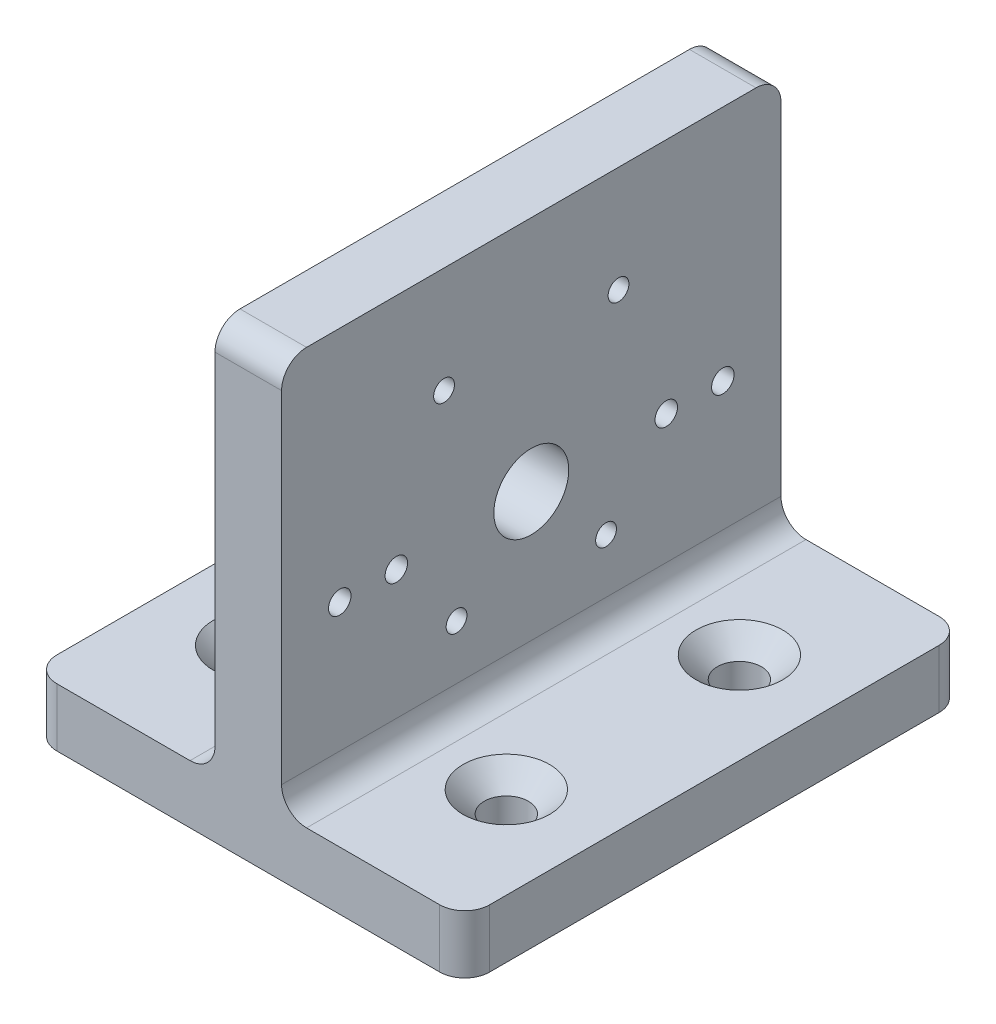
ISO-10303-21;
HEADER;
FILE_DESCRIPTION(('STEP AP214'),'2;1');
FILE_NAME('part.step','',(''),(''),'','','');
FILE_SCHEMA(('AUTOMOTIVE_DESIGN { 1 0 10303 214 1 1 1 1 }'));
ENDSEC;
DATA;
#1=APPLICATION_CONTEXT('core data for automotive mechanical design processes');
#2=APPLICATION_PROTOCOL_DEFINITION('international standard','automotive_design',2000,#1);
#3=PRODUCT_CONTEXT('',#1,'mechanical');
#4=PRODUCT('Part','Part','',(#3));
#5=PRODUCT_RELATED_PRODUCT_CATEGORY('part','',(#4));
#6=PRODUCT_DEFINITION_FORMATION('','',#4);
#7=PRODUCT_DEFINITION_CONTEXT('part definition',#1,'design');
#8=PRODUCT_DEFINITION('design','',#6,#7);
#9=PRODUCT_DEFINITION_SHAPE('','',#8);
#10=(LENGTH_UNIT() NAMED_UNIT(*) SI_UNIT(.MILLI.,.METRE.));
#11=(NAMED_UNIT(*) PLANE_ANGLE_UNIT() SI_UNIT($,.RADIAN.));
#12=(NAMED_UNIT(*) SI_UNIT($,.STERADIAN.) SOLID_ANGLE_UNIT());
#13=UNCERTAINTY_MEASURE_WITH_UNIT(LENGTH_MEASURE(1.E-05),#10,'distance_accuracy_value','');
#14=(GEOMETRIC_REPRESENTATION_CONTEXT(3) GLOBAL_UNCERTAINTY_ASSIGNED_CONTEXT((#13)) GLOBAL_UNIT_ASSIGNED_CONTEXT((#10,
#11,#12)) REPRESENTATION_CONTEXT('',''));
#15=CARTESIAN_POINT('',(0.,0.,0.));
#16=DIRECTION('',(0.,0.,1.));
#17=DIRECTION('',(1.,0.,0.));
#18=AXIS2_PLACEMENT_3D('',#15,#16,#17);
#19=CARTESIAN_POINT('',(-26.,0.,60.));
#20=DIRECTION('',(-1.,0.,0.));
#21=DIRECTION('',(0.,0.,1.));
#22=AXIS2_PLACEMENT_3D('',#19,#20,#21);
#23=PLANE('',#22);
#24=DIRECTION('',(0.,0.,-1.));
#25=VECTOR('',#24,1.);
#26=CARTESIAN_POINT('',(-26.,7.,60.));
#27=LINE('',#26,#25);
#28=CARTESIAN_POINT('',(-26.,7.,57.));
#29=VERTEX_POINT('',#28);
#30=CARTESIAN_POINT('',(-26.,7.,3.));
#31=VERTEX_POINT('',#30);
#32=EDGE_CURVE('E270',#29,#31,#27,.T.);
#33=ORIENTED_EDGE('',*,*,#32,.T.);
#34=DIRECTION('',(0.,1.,0.));
#35=VECTOR('',#34,1.);
#36=CARTESIAN_POINT('',(-26.,0.,3.));
#37=LINE('',#36,#35);
#38=CARTESIAN_POINT('',(-26.,0.,3.));
#39=VERTEX_POINT('',#38);
#40=EDGE_CURVE('E217',#31,#39,#37,.F.);
#41=ORIENTED_EDGE('',*,*,#40,.T.);
#42=DIRECTION('',(0.,0.,-1.));
#43=VECTOR('',#42,1.);
#44=CARTESIAN_POINT('',(-26.,0.,60.));
#45=LINE('',#44,#43);
#46=CARTESIAN_POINT('',(-26.,0.,57.));
#47=VERTEX_POINT('',#46);
#48=EDGE_CURVE('E177',#47,#39,#45,.T.);
#49=ORIENTED_EDGE('',*,*,#48,.F.);
#50=DIRECTION('',(0.,1.,0.));
#51=VECTOR('',#50,1.);
#52=CARTESIAN_POINT('',(-26.,0.,57.));
#53=LINE('',#52,#51);
#54=EDGE_CURVE('E214',#47,#29,#53,.T.);
#55=ORIENTED_EDGE('',*,*,#54,.T.);
#56=EDGE_LOOP('',(#33,#41,#49,#55));
#57=FACE_BOUND('',#56,.T.);
#58=ADVANCED_FACE('F35',(#57),#23,.T.);
#59=CARTESIAN_POINT('',(0.,0.,60.));
#60=DIRECTION('',(0.,1.,0.));
#61=DIRECTION('',(0.,0.,1.));
#62=AXIS2_PLACEMENT_3D('',#59,#60,#61);
#63=PLANE('',#62);
#64=CARTESIAN_POINT('',(-15.,0.,16.));
#65=DIRECTION('',(0.,1.,0.));
#66=DIRECTION('',(0.,0.,1.));
#67=AXIS2_PLACEMENT_3D('',#64,#65,#66);
#68=CIRCLE('',#67,2.65);
#69=CARTESIAN_POINT('',(-15.,0.,18.65));
#70=VERTEX_POINT('',#69);
#71=EDGE_CURVE('E389',#70,#70,#68,.T.);
#72=ORIENTED_EDGE('',*,*,#71,.T.);
#73=EDGE_LOOP('',(#72));
#74=FACE_BOUND('',#73,.T.);
#75=CARTESIAN_POINT('',(-15.,0.,44.));
#76=DIRECTION('',(0.,1.,0.));
#77=DIRECTION('',(0.,0.,1.));
#78=AXIS2_PLACEMENT_3D('',#75,#76,#77);
#79=CIRCLE('',#78,2.65);
#80=CARTESIAN_POINT('',(-15.,0.,46.65));
#81=VERTEX_POINT('',#80);
#82=EDGE_CURVE('E380',#81,#81,#79,.T.);
#83=ORIENTED_EDGE('',*,*,#82,.T.);
#84=EDGE_LOOP('',(#83));
#85=FACE_BOUND('',#84,.T.);
#86=CARTESIAN_POINT('',(15.,0.,44.));
#87=DIRECTION('',(0.,1.,0.));
#88=DIRECTION('',(0.,0.,1.));
#89=AXIS2_PLACEMENT_3D('',#86,#87,#88);
#90=CIRCLE('',#89,2.65);
#91=CARTESIAN_POINT('',(15.,0.,46.65));
#92=VERTEX_POINT('',#91);
#93=EDGE_CURVE('E371',#92,#92,#90,.T.);
#94=ORIENTED_EDGE('',*,*,#93,.T.);
#95=EDGE_LOOP('',(#94));
#96=FACE_BOUND('',#95,.T.);
#97=CARTESIAN_POINT('',(15.,0.,16.));
#98=DIRECTION('',(0.,1.,0.));
#99=DIRECTION('',(0.,0.,1.));
#100=AXIS2_PLACEMENT_3D('',#97,#98,#99);
#101=CIRCLE('',#100,2.65);
#102=CARTESIAN_POINT('',(15.,0.,18.65));
#103=VERTEX_POINT('',#102);
#104=EDGE_CURVE('E362',#103,#103,#101,.T.);
#105=ORIENTED_EDGE('',*,*,#104,.T.);
#106=EDGE_LOOP('',(#105));
#107=FACE_BOUND('',#106,.T.);
#108=DIRECTION('',(1.,0.,0.));
#109=VECTOR('',#108,1.);
#110=CARTESIAN_POINT('',(0.,0.,0.));
#111=LINE('',#110,#109);
#112=CARTESIAN_POINT('',(-23.,0.,0.));
#113=VERTEX_POINT('',#112);
#114=CARTESIAN_POINT('',(23.,0.,0.));
#115=VERTEX_POINT('',#114);
#116=EDGE_CURVE('E279',#113,#115,#111,.T.);
#117=ORIENTED_EDGE('',*,*,#116,.T.);
#118=CARTESIAN_POINT('',(23.,0.,3.));
#119=DIRECTION('',(0.,1.,0.));
#120=DIRECTION('',(0.,0.,1.));
#121=AXIS2_PLACEMENT_3D('',#118,#119,#120);
#122=CIRCLE('',#121,3.);
#123=CARTESIAN_POINT('',(26.,0.,3.));
#124=VERTEX_POINT('',#123);
#125=EDGE_CURVE('E199',#115,#124,#122,.F.);
#126=ORIENTED_EDGE('',*,*,#125,.T.);
#127=DIRECTION('',(0.,0.,-1.));
#128=VECTOR('',#127,1.);
#129=CARTESIAN_POINT('',(26.,0.,60.));
#130=LINE('',#129,#128);
#131=CARTESIAN_POINT('',(26.,0.,57.));
#132=VERTEX_POINT('',#131);
#133=EDGE_CURVE('E171',#132,#124,#130,.T.);
#134=ORIENTED_EDGE('',*,*,#133,.F.);
#135=CARTESIAN_POINT('',(23.,0.,57.));
#136=DIRECTION('',(0.,1.,0.));
#137=DIRECTION('',(0.,0.,1.));
#138=AXIS2_PLACEMENT_3D('',#135,#136,#137);
#139=CIRCLE('',#138,3.);
#140=CARTESIAN_POINT('',(23.,0.,60.));
#141=VERTEX_POINT('',#140);
#142=EDGE_CURVE('E176',#132,#141,#139,.F.);
#143=ORIENTED_EDGE('',*,*,#142,.T.);
#144=DIRECTION('',(1.,0.,0.));
#145=VECTOR('',#144,1.);
#146=CARTESIAN_POINT('',(0.,0.,60.));
#147=LINE('',#146,#145);
#148=CARTESIAN_POINT('',(-23.,0.,60.));
#149=VERTEX_POINT('',#148);
#150=EDGE_CURVE('E287',#149,#141,#147,.T.);
#151=ORIENTED_EDGE('',*,*,#150,.F.);
#152=CARTESIAN_POINT('',(-23.,0.,57.));
#153=DIRECTION('',(0.,1.,0.));
#154=DIRECTION('',(0.,0.,1.));
#155=AXIS2_PLACEMENT_3D('',#152,#153,#154);
#156=CIRCLE('',#155,3.);
#157=EDGE_CURVE('E194',#149,#47,#156,.F.);
#158=ORIENTED_EDGE('',*,*,#157,.T.);
#159=ORIENTED_EDGE('',*,*,#48,.T.);
#160=CARTESIAN_POINT('',(-23.,0.,3.));
#161=DIRECTION('',(0.,1.,0.));
#162=DIRECTION('',(0.,0.,1.));
#163=AXIS2_PLACEMENT_3D('',#160,#161,#162);
#164=CIRCLE('',#163,3.);
#165=EDGE_CURVE('E196',#39,#113,#164,.F.);
#166=ORIENTED_EDGE('',*,*,#165,.T.);
#167=EDGE_LOOP('',(#117,#126,#134,#143,#151,#158,#159,#166));
#168=FACE_BOUND('',#167,.T.);
#169=ADVANCED_FACE('F423',(#74,#85,#96,#107,#168),#63,.F.);
#170=CARTESIAN_POINT('',(26.,0.,60.));
#171=DIRECTION('',(-1.,0.,0.));
#172=DIRECTION('',(0.,0.,1.));
#173=AXIS2_PLACEMENT_3D('',#170,#171,#172);
#174=PLANE('',#173);
#175=ORIENTED_EDGE('',*,*,#133,.T.);
#176=DIRECTION('',(0.,1.,0.));
#177=VECTOR('',#176,1.);
#178=CARTESIAN_POINT('',(26.,0.,3.));
#179=LINE('',#178,#177);
#180=CARTESIAN_POINT('',(26.,7.,3.));
#181=VERTEX_POINT('',#180);
#182=EDGE_CURVE('E170',#124,#181,#179,.T.);
#183=ORIENTED_EDGE('',*,*,#182,.T.);
#184=DIRECTION('',(0.,0.,-1.));
#185=VECTOR('',#184,1.);
#186=CARTESIAN_POINT('',(26.,7.,60.));
#187=LINE('',#186,#185);
#188=CARTESIAN_POINT('',(26.,7.,57.));
#189=VERTEX_POINT('',#188);
#190=EDGE_CURVE('E153',#189,#181,#187,.T.);
#191=ORIENTED_EDGE('',*,*,#190,.F.);
#192=DIRECTION('',(0.,1.,0.));
#193=VECTOR('',#192,1.);
#194=CARTESIAN_POINT('',(26.,0.,57.));
#195=LINE('',#194,#193);
#196=EDGE_CURVE('E167',#189,#132,#195,.F.);
#197=ORIENTED_EDGE('',*,*,#196,.T.);
#198=EDGE_LOOP('',(#175,#183,#191,#197));
#199=FACE_BOUND('',#198,.T.);
#200=ADVANCED_FACE('F166',(#199),#174,.F.);
#201=CARTESIAN_POINT('',(0.,7.,60.));
#202=DIRECTION('',(0.,1.,0.));
#203=DIRECTION('',(-1.,0.,0.));
#204=AXIS2_PLACEMENT_3D('',#201,#202,#203);
#205=PLANE('',#204);
#206=CARTESIAN_POINT('',(15.,7.,44.));
#207=DIRECTION('',(0.,1.,0.));
#208=DIRECTION('',(0.,0.,1.));
#209=AXIS2_PLACEMENT_3D('',#206,#207,#208);
#210=CIRCLE('',#209,5.2);
#211=CARTESIAN_POINT('',(15.,7.,49.2));
#212=VERTEX_POINT('',#211);
#213=EDGE_CURVE('E377',#212,#212,#210,.T.);
#214=ORIENTED_EDGE('',*,*,#213,.F.);
#215=EDGE_LOOP('',(#214));
#216=FACE_BOUND('',#215,.T.);
#217=CARTESIAN_POINT('',(15.,7.,16.));
#218=DIRECTION('',(0.,1.,0.));
#219=DIRECTION('',(0.,0.,1.));
#220=AXIS2_PLACEMENT_3D('',#217,#218,#219);
#221=CIRCLE('',#220,5.2);
#222=CARTESIAN_POINT('',(15.,7.,21.2));
#223=VERTEX_POINT('',#222);
#224=EDGE_CURVE('E368',#223,#223,#221,.T.);
#225=ORIENTED_EDGE('',*,*,#224,.F.);
#226=EDGE_LOOP('',(#225));
#227=FACE_BOUND('',#226,.T.);
#228=ORIENTED_EDGE('',*,*,#190,.T.);
#229=CARTESIAN_POINT('',(23.,7.,3.));
#230=DIRECTION('',(0.,1.,0.));
#231=DIRECTION('',(-1.,0.,0.));
#232=AXIS2_PLACEMENT_3D('',#229,#230,#231);
#233=CIRCLE('',#232,3.);
#234=CARTESIAN_POINT('',(23.,7.,0.));
#235=VERTEX_POINT('',#234);
#236=EDGE_CURVE('E160',#181,#235,#233,.T.);
#237=ORIENTED_EDGE('',*,*,#236,.T.);
#238=DIRECTION('',(1.,0.,0.));
#239=VECTOR('',#238,1.);
#240=CARTESIAN_POINT('',(0.,7.,0.));
#241=LINE('',#240,#239);
#242=CARTESIAN_POINT('',(7.,7.,0.));
#243=VERTEX_POINT('',#242);
#244=EDGE_CURVE('E282',#243,#235,#241,.T.);
#245=ORIENTED_EDGE('',*,*,#244,.F.);
#246=DIRECTION('',(0.,0.,-1.));
#247=VECTOR('',#246,1.);
#248=CARTESIAN_POINT('',(7.,7.,60.));
#249=LINE('',#248,#247);
#250=CARTESIAN_POINT('',(7.,7.,60.));
#251=VERTEX_POINT('',#250);
#252=EDGE_CURVE('E161',#243,#251,#249,.F.);
#253=ORIENTED_EDGE('',*,*,#252,.T.);
#254=DIRECTION('',(1.,0.,0.));
#255=VECTOR('',#254,1.);
#256=CARTESIAN_POINT('',(0.,7.,60.));
#257=LINE('',#256,#255);
#258=CARTESIAN_POINT('',(23.,7.,60.));
#259=VERTEX_POINT('',#258);
#260=EDGE_CURVE('E155',#251,#259,#257,.T.);
#261=ORIENTED_EDGE('',*,*,#260,.T.);
#262=CARTESIAN_POINT('',(23.,7.,57.));
#263=DIRECTION('',(0.,1.,0.));
#264=DIRECTION('',(-1.,0.,0.));
#265=AXIS2_PLACEMENT_3D('',#262,#263,#264);
#266=CIRCLE('',#265,3.);
#267=EDGE_CURVE('E150',#259,#189,#266,.T.);
#268=ORIENTED_EDGE('',*,*,#267,.T.);
#269=EDGE_LOOP('',(#228,#237,#245,#253,#261,#268));
#270=FACE_BOUND('',#269,.T.);
#271=ADVANCED_FACE('F152',(#216,#227,#270),#205,.T.);
#272=CARTESIAN_POINT('',(4.,0.,60.));
#273=DIRECTION('',(1.,0.,0.));
#274=DIRECTION('',(0.,1.,0.));
#275=AXIS2_PLACEMENT_3D('',#272,#273,#274);
#276=PLANE('',#275);
#277=CARTESIAN_POINT('',(4.00000000000001,41.25,40.48));
#278=DIRECTION('',(1.,0.,0.));
#279=DIRECTION('',(0.,0.,-1.));
#280=AXIS2_PLACEMENT_3D('',#277,#278,#279);
#281=CIRCLE('',#280,1.25);
#282=CARTESIAN_POINT('',(4.00000000000001,41.25,39.23));
#283=VERTEX_POINT('',#282);
#284=EDGE_CURVE('E359',#283,#283,#281,.T.);
#285=ORIENTED_EDGE('',*,*,#284,.F.);
#286=EDGE_LOOP('',(#285));
#287=FACE_BOUND('',#286,.T.);
#288=CARTESIAN_POINT('',(4.00000000000001,41.25,19.52));
#289=DIRECTION('',(1.,0.,0.));
#290=DIRECTION('',(0.,0.,-1.));
#291=AXIS2_PLACEMENT_3D('',#288,#289,#290);
#292=CIRCLE('',#291,1.25);
#293=CARTESIAN_POINT('',(4.00000000000001,41.25,18.27));
#294=VERTEX_POINT('',#293);
#295=EDGE_CURVE('E353',#294,#294,#292,.T.);
#296=ORIENTED_EDGE('',*,*,#295,.F.);
#297=EDGE_LOOP('',(#296));
#298=FACE_BOUND('',#297,.T.);
#299=CARTESIAN_POINT('',(4.,16.5197438789309,21.0197438789308));
#300=DIRECTION('',(1.,0.,0.));
#301=DIRECTION('',(0.,0.,-1.));
#302=AXIS2_PLACEMENT_3D('',#299,#300,#301);
#303=CIRCLE('',#302,1.25);
#304=CARTESIAN_POINT('',(4.,16.5197438789309,19.7697438789308));
#305=VERTEX_POINT('',#304);
#306=EDGE_CURVE('E350',#305,#305,#303,.T.);
#307=ORIENTED_EDGE('',*,*,#306,.F.);
#308=EDGE_LOOP('',(#307));
#309=FACE_BOUND('',#308,.T.);
#310=CARTESIAN_POINT('',(4.,16.5197438789309,38.9802561210692));
#311=DIRECTION('',(1.,0.,0.));
#312=DIRECTION('',(0.,0.,-1.));
#313=AXIS2_PLACEMENT_3D('',#310,#311,#312);
#314=CIRCLE('',#313,1.25);
#315=CARTESIAN_POINT('',(4.,16.5197438789309,37.7302561210692));
#316=VERTEX_POINT('',#315);
#317=EDGE_CURVE('E344',#316,#316,#314,.T.);
#318=ORIENTED_EDGE('',*,*,#317,.F.);
#319=EDGE_LOOP('',(#318));
#320=FACE_BOUND('',#319,.T.);
#321=CARTESIAN_POINT('',(4.,25.5,46.215));
#322=DIRECTION('',(1.,0.,0.));
#323=DIRECTION('',(0.,0.,-1.));
#324=AXIS2_PLACEMENT_3D('',#321,#322,#323);
#325=CIRCLE('',#324,1.34999999999999);
#326=CARTESIAN_POINT('',(4.,25.5,44.865));
#327=VERTEX_POINT('',#326);
#328=EDGE_CURVE('E338',#327,#327,#325,.T.);
#329=ORIENTED_EDGE('',*,*,#328,.F.);
#330=EDGE_LOOP('',(#329));
#331=FACE_BOUND('',#330,.T.);
#332=CARTESIAN_POINT('',(4.,25.5,13.785));
#333=DIRECTION('',(1.,0.,0.));
#334=DIRECTION('',(0.,0.,-1.));
#335=AXIS2_PLACEMENT_3D('',#332,#333,#334);
#336=CIRCLE('',#335,1.34999999999999);
#337=CARTESIAN_POINT('',(4.,25.5,12.435));
#338=VERTEX_POINT('',#337);
#339=EDGE_CURVE('E332',#338,#338,#336,.T.);
#340=ORIENTED_EDGE('',*,*,#339,.F.);
#341=EDGE_LOOP('',(#340));
#342=FACE_BOUND('',#341,.T.);
#343=CARTESIAN_POINT('',(4.,25.5,53.0125));
#344=DIRECTION('',(1.,0.,0.));
#345=DIRECTION('',(0.,0.,-1.));
#346=AXIS2_PLACEMENT_3D('',#343,#344,#345);
#347=CIRCLE('',#346,1.34999999999999);
#348=CARTESIAN_POINT('',(4.,25.5,51.6625));
#349=VERTEX_POINT('',#348);
#350=EDGE_CURVE('E326',#349,#349,#347,.T.);
#351=ORIENTED_EDGE('',*,*,#350,.F.);
#352=EDGE_LOOP('',(#351));
#353=FACE_BOUND('',#352,.T.);
#354=CARTESIAN_POINT('',(4.,25.5,6.9875));
#355=DIRECTION('',(1.,0.,0.));
#356=DIRECTION('',(0.,0.,-1.));
#357=AXIS2_PLACEMENT_3D('',#354,#355,#356);
#358=CIRCLE('',#357,1.34999999999999);
#359=CARTESIAN_POINT('',(4.,25.5,5.63750000000001));
#360=VERTEX_POINT('',#359);
#361=EDGE_CURVE('E320',#360,#360,#358,.T.);
#362=ORIENTED_EDGE('',*,*,#361,.F.);
#363=EDGE_LOOP('',(#362));
#364=FACE_BOUND('',#363,.T.);
#365=CARTESIAN_POINT('',(4.,25.5,30.));
#366=DIRECTION('',(1.,0.,0.));
#367=DIRECTION('',(0.,1.,0.));
#368=AXIS2_PLACEMENT_3D('',#365,#366,#367);
#369=CIRCLE('',#368,4.50000000000003);
#370=CARTESIAN_POINT('',(3.99999999999999,30.,30.));
#371=VERTEX_POINT('',#370);
#372=EDGE_CURVE('E314',#371,#371,#369,.T.);
#373=ORIENTED_EDGE('',*,*,#372,.F.);
#374=EDGE_LOOP('',(#373));
#375=FACE_BOUND('',#374,.T.);
#376=DIRECTION('',(0.,-1.,0.));
#377=VECTOR('',#376,1.);
#378=CARTESIAN_POINT('',(4.,0.,60.));
#379=LINE('',#378,#377);
#380=CARTESIAN_POINT('',(4.,51.,60.));
#381=VERTEX_POINT('',#380);
#382=CARTESIAN_POINT('',(4.,10.,60.));
#383=VERTEX_POINT('',#382);
#384=EDGE_CURVE('E275',#381,#383,#379,.T.);
#385=ORIENTED_EDGE('',*,*,#384,.T.);
#386=DIRECTION('',(0.,0.,-1.));
#387=VECTOR('',#386,1.);
#388=CARTESIAN_POINT('',(4.,10.,0.));
#389=LINE('',#388,#387);
#390=CARTESIAN_POINT('',(4.,10.,0.));
#391=VERTEX_POINT('',#390);
#392=EDGE_CURVE('E223',#383,#391,#389,.T.);
#393=ORIENTED_EDGE('',*,*,#392,.T.);
#394=DIRECTION('',(0.,-1.,0.));
#395=VECTOR('',#394,1.);
#396=CARTESIAN_POINT('',(4.,0.,0.));
#397=LINE('',#396,#395);
#398=CARTESIAN_POINT('',(4.,51.,0.));
#399=VERTEX_POINT('',#398);
#400=EDGE_CURVE('E255',#399,#391,#397,.T.);
#401=ORIENTED_EDGE('',*,*,#400,.F.);
#402=CARTESIAN_POINT('',(4.,51.,3.));
#403=DIRECTION('',(1.,0.,0.));
#404=DIRECTION('',(0.,1.,0.));
#405=AXIS2_PLACEMENT_3D('',#402,#403,#404);
#406=CIRCLE('',#405,3.);
#407=CARTESIAN_POINT('',(4.,54.,3.));
#408=VERTEX_POINT('',#407);
#409=EDGE_CURVE('E221',#399,#408,#406,.T.);
#410=ORIENTED_EDGE('',*,*,#409,.T.);
#411=DIRECTION('',(0.,0.,-1.));
#412=VECTOR('',#411,1.);
#413=CARTESIAN_POINT('',(4.,54.,60.));
#414=LINE('',#413,#412);
#415=CARTESIAN_POINT('',(4.,54.,57.));
#416=VERTEX_POINT('',#415);
#417=EDGE_CURVE('E172',#416,#408,#414,.T.);
#418=ORIENTED_EDGE('',*,*,#417,.F.);
#419=CARTESIAN_POINT('',(4.,51.,57.));
#420=DIRECTION('',(1.,0.,0.));
#421=DIRECTION('',(0.,1.,0.));
#422=AXIS2_PLACEMENT_3D('',#419,#420,#421);
#423=CIRCLE('',#422,3.);
#424=EDGE_CURVE('E219',#416,#381,#423,.T.);
#425=ORIENTED_EDGE('',*,*,#424,.T.);
#426=EDGE_LOOP('',(#385,#393,#401,#410,#418,#425));
#427=FACE_BOUND('',#426,.T.);
#428=ADVANCED_FACE('F305',(#287,#298,#309,#320,#331,#342,#353,#364,#375,#427),#276,.T.);
#429=CARTESIAN_POINT('',(0.,54.,60.));
#430=DIRECTION('',(0.,1.,0.));
#431=DIRECTION('',(0.,0.,1.));
#432=AXIS2_PLACEMENT_3D('',#429,#430,#431);
#433=PLANE('',#432);
#434=ORIENTED_EDGE('',*,*,#417,.T.);
#435=DIRECTION('',(1.,0.,0.));
#436=VECTOR('',#435,1.);
#437=CARTESIAN_POINT('',(-4.,54.,3.));
#438=LINE('',#437,#436);
#439=CARTESIAN_POINT('',(-4.,54.,3.));
#440=VERTEX_POINT('',#439);
#441=EDGE_CURVE('E51',#408,#440,#438,.F.);
#442=ORIENTED_EDGE('',*,*,#441,.T.);
#443=DIRECTION('',(0.,0.,-1.));
#444=VECTOR('',#443,1.);
#445=CARTESIAN_POINT('',(-4.,54.,60.));
#446=LINE('',#445,#444);
#447=CARTESIAN_POINT('',(-4.,54.,57.));
#448=VERTEX_POINT('',#447);
#449=EDGE_CURVE('E273',#448,#440,#446,.T.);
#450=ORIENTED_EDGE('',*,*,#449,.F.);
#451=DIRECTION('',(1.,0.,0.));
#452=VECTOR('',#451,1.);
#453=CARTESIAN_POINT('',(0.,54.,57.));
#454=LINE('',#453,#452);
#455=EDGE_CURVE('E231',#448,#416,#454,.T.);
#456=ORIENTED_EDGE('',*,*,#455,.T.);
#457=EDGE_LOOP('',(#434,#442,#450,#456));
#458=FACE_BOUND('',#457,.T.);
#459=ADVANCED_FACE('F456',(#458),#433,.T.);
#460=CARTESIAN_POINT('',(-4.,0.,60.));
#461=DIRECTION('',(1.,0.,0.));
#462=DIRECTION('',(0.,1.,0.));
#463=AXIS2_PLACEMENT_3D('',#460,#461,#462);
#464=PLANE('',#463);
#465=CARTESIAN_POINT('',(-4.,41.25,40.48));
#466=DIRECTION('',(1.,0.,0.));
#467=DIRECTION('',(0.,1.,0.));
#468=AXIS2_PLACEMENT_3D('',#465,#466,#467);
#469=CIRCLE('',#468,1.25);
#470=CARTESIAN_POINT('',(-4.,42.5,40.48));
#471=VERTEX_POINT('',#470);
#472=EDGE_CURVE('E356',#471,#471,#469,.T.);
#473=ORIENTED_EDGE('',*,*,#472,.T.);
#474=EDGE_LOOP('',(#473));
#475=FACE_BOUND('',#474,.T.);
#476=CARTESIAN_POINT('',(-4.,41.25,19.52));
#477=DIRECTION('',(1.,0.,0.));
#478=DIRECTION('',(0.,1.,0.));
#479=AXIS2_PLACEMENT_3D('',#476,#477,#478);
#480=CIRCLE('',#479,1.25);
#481=CARTESIAN_POINT('',(-4.,42.5,19.52));
#482=VERTEX_POINT('',#481);
#483=EDGE_CURVE('E39',#482,#482,#480,.T.);
#484=ORIENTED_EDGE('',*,*,#483,.T.);
#485=EDGE_LOOP('',(#484));
#486=FACE_BOUND('',#485,.T.);
#487=CARTESIAN_POINT('',(-4.,16.5197438789309,21.0197438789308));
#488=DIRECTION('',(1.,0.,0.));
#489=DIRECTION('',(0.,1.,0.));
#490=AXIS2_PLACEMENT_3D('',#487,#488,#489);
#491=CIRCLE('',#490,1.25);
#492=CARTESIAN_POINT('',(-4.,17.7697438789309,21.0197438789308));
#493=VERTEX_POINT('',#492);
#494=EDGE_CURVE('E347',#493,#493,#491,.T.);
#495=ORIENTED_EDGE('',*,*,#494,.T.);
#496=EDGE_LOOP('',(#495));
#497=FACE_BOUND('',#496,.T.);
#498=CARTESIAN_POINT('',(-4.,16.5197438789309,38.9802561210692));
#499=DIRECTION('',(1.,0.,0.));
#500=DIRECTION('',(0.,1.,0.));
#501=AXIS2_PLACEMENT_3D('',#498,#499,#500);
#502=CIRCLE('',#501,1.25);
#503=CARTESIAN_POINT('',(-4.,17.7697438789309,38.9802561210692));
#504=VERTEX_POINT('',#503);
#505=EDGE_CURVE('E341',#504,#504,#502,.T.);
#506=ORIENTED_EDGE('',*,*,#505,.T.);
#507=EDGE_LOOP('',(#506));
#508=FACE_BOUND('',#507,.T.);
#509=CARTESIAN_POINT('',(-4.,25.5,46.215));
#510=DIRECTION('',(1.,0.,0.));
#511=DIRECTION('',(0.,1.,0.));
#512=AXIS2_PLACEMENT_3D('',#509,#510,#511);
#513=CIRCLE('',#512,1.34999999999999);
#514=CARTESIAN_POINT('',(-4.,26.85,46.215));
#515=VERTEX_POINT('',#514);
#516=EDGE_CURVE('E335',#515,#515,#513,.T.);
#517=ORIENTED_EDGE('',*,*,#516,.T.);
#518=EDGE_LOOP('',(#517));
#519=FACE_BOUND('',#518,.T.);
#520=CARTESIAN_POINT('',(-4.,25.5,13.785));
#521=DIRECTION('',(1.,0.,0.));
#522=DIRECTION('',(0.,1.,0.));
#523=AXIS2_PLACEMENT_3D('',#520,#521,#522);
#524=CIRCLE('',#523,1.34999999999999);
#525=CARTESIAN_POINT('',(-4.,26.85,13.785));
#526=VERTEX_POINT('',#525);
#527=EDGE_CURVE('E329',#526,#526,#524,.T.);
#528=ORIENTED_EDGE('',*,*,#527,.T.);
#529=EDGE_LOOP('',(#528));
#530=FACE_BOUND('',#529,.T.);
#531=CARTESIAN_POINT('',(-4.,25.5,53.0125));
#532=DIRECTION('',(1.,0.,0.));
#533=DIRECTION('',(0.,1.,0.));
#534=AXIS2_PLACEMENT_3D('',#531,#532,#533);
#535=CIRCLE('',#534,1.34999999999999);
#536=CARTESIAN_POINT('',(-4.,26.85,53.0125));
#537=VERTEX_POINT('',#536);
#538=EDGE_CURVE('E323',#537,#537,#535,.T.);
#539=ORIENTED_EDGE('',*,*,#538,.T.);
#540=EDGE_LOOP('',(#539));
#541=FACE_BOUND('',#540,.T.);
#542=CARTESIAN_POINT('',(-4.,25.5,6.9875));
#543=DIRECTION('',(1.,0.,0.));
#544=DIRECTION('',(0.,1.,0.));
#545=AXIS2_PLACEMENT_3D('',#542,#543,#544);
#546=CIRCLE('',#545,1.34999999999999);
#547=CARTESIAN_POINT('',(-4.,26.85,6.9875));
#548=VERTEX_POINT('',#547);
#549=EDGE_CURVE('E317',#548,#548,#546,.T.);
#550=ORIENTED_EDGE('',*,*,#549,.T.);
#551=EDGE_LOOP('',(#550));
#552=FACE_BOUND('',#551,.T.);
#553=CARTESIAN_POINT('',(-4.,25.5,30.));
#554=DIRECTION('',(1.,0.,0.));
#555=DIRECTION('',(0.,1.,0.));
#556=AXIS2_PLACEMENT_3D('',#553,#554,#555);
#557=CIRCLE('',#556,4.50000000000003);
#558=CARTESIAN_POINT('',(-4.,30.,30.));
#559=VERTEX_POINT('',#558);
#560=EDGE_CURVE('E283',#559,#559,#557,.F.);
#561=ORIENTED_EDGE('',*,*,#560,.F.);
#562=EDGE_LOOP('',(#561));
#563=FACE_BOUND('',#562,.T.);
#564=DIRECTION('',(0.,-1.,0.));
#565=VECTOR('',#564,1.);
#566=CARTESIAN_POINT('',(-4.,0.,0.));
#567=LINE('',#566,#565);
#568=CARTESIAN_POINT('',(-4.,51.,0.));
#569=VERTEX_POINT('',#568);
#570=CARTESIAN_POINT('',(-4.,10.,0.));
#571=VERTEX_POINT('',#570);
#572=EDGE_CURVE('E245',#569,#571,#567,.T.);
#573=ORIENTED_EDGE('',*,*,#572,.T.);
#574=DIRECTION('',(0.,0.,-1.));
#575=VECTOR('',#574,1.);
#576=CARTESIAN_POINT('',(-4.,10.,60.));
#577=LINE('',#576,#575);
#578=CARTESIAN_POINT('',(-4.,10.,60.));
#579=VERTEX_POINT('',#578);
#580=EDGE_CURVE('E229',#571,#579,#577,.F.);
#581=ORIENTED_EDGE('',*,*,#580,.T.);
#582=DIRECTION('',(0.,-1.,0.));
#583=VECTOR('',#582,1.);
#584=CARTESIAN_POINT('',(-4.,0.,60.));
#585=LINE('',#584,#583);
#586=CARTESIAN_POINT('',(-4.,51.,60.));
#587=VERTEX_POINT('',#586);
#588=EDGE_CURVE('E266',#587,#579,#585,.T.);
#589=ORIENTED_EDGE('',*,*,#588,.F.);
#590=CARTESIAN_POINT('',(-4.,51.,57.));
#591=DIRECTION('',(1.,0.,0.));
#592=DIRECTION('',(0.,1.,0.));
#593=AXIS2_PLACEMENT_3D('',#590,#591,#592);
#594=CIRCLE('',#593,3.);
#595=EDGE_CURVE('E58',#587,#448,#594,.F.);
#596=ORIENTED_EDGE('',*,*,#595,.T.);
#597=ORIENTED_EDGE('',*,*,#449,.T.);
#598=CARTESIAN_POINT('',(-4.,51.,3.));
#599=DIRECTION('',(1.,0.,0.));
#600=DIRECTION('',(0.,1.,0.));
#601=AXIS2_PLACEMENT_3D('',#598,#599,#600);
#602=CIRCLE('',#601,3.);
#603=EDGE_CURVE('E227',#440,#569,#602,.F.);
#604=ORIENTED_EDGE('',*,*,#603,.T.);
#605=EDGE_LOOP('',(#573,#581,#589,#596,#597,#604));
#606=FACE_BOUND('',#605,.T.);
#607=ADVANCED_FACE('F252',(#475,#486,#497,#508,#519,#530,#541,#552,#563,#606),#464,.F.);
#608=CARTESIAN_POINT('',(0.,7.,60.));
#609=DIRECTION('',(0.,-1.,0.));
#610=DIRECTION('',(1.,0.,0.));
#611=AXIS2_PLACEMENT_3D('',#608,#609,#610);
#612=PLANE('',#611);
#613=CARTESIAN_POINT('',(-15.,7.00000000000001,16.));
#614=DIRECTION('',(0.,1.,0.));
#615=DIRECTION('',(0.,0.,1.));
#616=AXIS2_PLACEMENT_3D('',#613,#614,#615);
#617=CIRCLE('',#616,5.2);
#618=CARTESIAN_POINT('',(-15.,7.00000000000001,21.2));
#619=VERTEX_POINT('',#618);
#620=EDGE_CURVE('E395',#619,#619,#617,.T.);
#621=ORIENTED_EDGE('',*,*,#620,.F.);
#622=EDGE_LOOP('',(#621));
#623=FACE_BOUND('',#622,.T.);
#624=CARTESIAN_POINT('',(-15.,7.00000000000001,44.));
#625=DIRECTION('',(0.,1.,0.));
#626=DIRECTION('',(0.,0.,1.));
#627=AXIS2_PLACEMENT_3D('',#624,#625,#626);
#628=CIRCLE('',#627,5.2);
#629=CARTESIAN_POINT('',(-15.,7.00000000000001,49.2));
#630=VERTEX_POINT('',#629);
#631=EDGE_CURVE('E386',#630,#630,#628,.T.);
#632=ORIENTED_EDGE('',*,*,#631,.F.);
#633=EDGE_LOOP('',(#632));
#634=FACE_BOUND('',#633,.T.);
#635=DIRECTION('',(-1.,0.,0.));
#636=VECTOR('',#635,1.);
#637=CARTESIAN_POINT('',(0.,7.,0.));
#638=LINE('',#637,#636);
#639=CARTESIAN_POINT('',(-7.,7.,0.));
#640=VERTEX_POINT('',#639);
#641=CARTESIAN_POINT('',(-23.,7.,0.));
#642=VERTEX_POINT('',#641);
#643=EDGE_CURVE('E248',#640,#642,#638,.T.);
#644=ORIENTED_EDGE('',*,*,#643,.T.);
#645=CARTESIAN_POINT('',(-23.,7.,3.));
#646=DIRECTION('',(0.,-1.,0.));
#647=DIRECTION('',(1.,0.,0.));
#648=AXIS2_PLACEMENT_3D('',#645,#646,#647);
#649=CIRCLE('',#648,3.);
#650=EDGE_CURVE('E212',#642,#31,#649,.F.);
#651=ORIENTED_EDGE('',*,*,#650,.T.);
#652=ORIENTED_EDGE('',*,*,#32,.F.);
#653=CARTESIAN_POINT('',(-23.,7.,57.));
#654=DIRECTION('',(0.,-1.,0.));
#655=DIRECTION('',(1.,0.,0.));
#656=AXIS2_PLACEMENT_3D('',#653,#654,#655);
#657=CIRCLE('',#656,3.);
#658=CARTESIAN_POINT('',(-23.,7.,60.));
#659=VERTEX_POINT('',#658);
#660=EDGE_CURVE('E210',#29,#659,#657,.F.);
#661=ORIENTED_EDGE('',*,*,#660,.T.);
#662=DIRECTION('',(-1.,0.,0.));
#663=VECTOR('',#662,1.);
#664=CARTESIAN_POINT('',(0.,7.,60.));
#665=LINE('',#664,#663);
#666=CARTESIAN_POINT('',(-7.,7.,60.));
#667=VERTEX_POINT('',#666);
#668=EDGE_CURVE('E264',#667,#659,#665,.T.);
#669=ORIENTED_EDGE('',*,*,#668,.F.);
#670=DIRECTION('',(0.,0.,-1.));
#671=VECTOR('',#670,1.);
#672=CARTESIAN_POINT('',(-7.,7.,0.));
#673=LINE('',#672,#671);
#674=EDGE_CURVE('E207',#667,#640,#673,.T.);
#675=ORIENTED_EDGE('',*,*,#674,.T.);
#676=EDGE_LOOP('',(#644,#651,#652,#661,#669,#675));
#677=FACE_BOUND('',#676,.T.);
#678=ADVANCED_FACE('F268',(#623,#634,#677),#612,.F.);
#679=CARTESIAN_POINT('',(0.,0.,60.));
#680=DIRECTION('',(0.,0.,1.));
#681=DIRECTION('',(1.,0.,0.));
#682=AXIS2_PLACEMENT_3D('',#679,#680,#681);
#683=PLANE('',#682);
#684=ORIENTED_EDGE('',*,*,#150,.T.);
#685=DIRECTION('',(0.,1.,0.));
#686=VECTOR('',#685,1.);
#687=CARTESIAN_POINT('',(23.,7.,60.));
#688=LINE('',#687,#686);
#689=EDGE_CURVE('E205',#141,#259,#688,.T.);
#690=ORIENTED_EDGE('',*,*,#689,.T.);
#691=ORIENTED_EDGE('',*,*,#260,.F.);
#692=CARTESIAN_POINT('',(7.,10.,60.));
#693=DIRECTION('',(0.,0.,1.));
#694=DIRECTION('',(1.,0.,0.));
#695=AXIS2_PLACEMENT_3D('',#692,#693,#694);
#696=CIRCLE('',#695,3.);
#697=EDGE_CURVE('E237',#251,#383,#696,.F.);
#698=ORIENTED_EDGE('',*,*,#697,.T.);
#699=ORIENTED_EDGE('',*,*,#384,.F.);
#700=DIRECTION('',(1.,0.,0.));
#701=VECTOR('',#700,1.);
#702=CARTESIAN_POINT('',(0.,51.,60.));
#703=LINE('',#702,#701);
#704=EDGE_CURVE('E201',#381,#587,#703,.F.);
#705=ORIENTED_EDGE('',*,*,#704,.T.);
#706=ORIENTED_EDGE('',*,*,#588,.T.);
#707=CARTESIAN_POINT('',(-7.,10.,60.));
#708=DIRECTION('',(0.,0.,1.));
#709=DIRECTION('',(1.,0.,0.));
#710=AXIS2_PLACEMENT_3D('',#707,#708,#709);
#711=CIRCLE('',#710,3.);
#712=EDGE_CURVE('E11',#579,#667,#711,.F.);
#713=ORIENTED_EDGE('',*,*,#712,.T.);
#714=ORIENTED_EDGE('',*,*,#668,.T.);
#715=DIRECTION('',(0.,1.,0.));
#716=VECTOR('',#715,1.);
#717=CARTESIAN_POINT('',(-23.,0.,60.));
#718=LINE('',#717,#716);
#719=EDGE_CURVE('E203',#659,#149,#718,.F.);
#720=ORIENTED_EDGE('',*,*,#719,.T.);
#721=EDGE_LOOP('',(#684,#690,#691,#698,#699,#705,#706,#713,#714,#720));
#722=FACE_BOUND('',#721,.T.);
#723=ADVANCED_FACE('F263',(#722),#683,.T.);
#724=CARTESIAN_POINT('',(0.,0.,0.));
#725=DIRECTION('',(0.,0.,1.));
#726=DIRECTION('',(1.,0.,0.));
#727=AXIS2_PLACEMENT_3D('',#724,#725,#726);
#728=PLANE('',#727);
#729=ORIENTED_EDGE('',*,*,#244,.T.);
#730=DIRECTION('',(0.,1.,0.));
#731=VECTOR('',#730,1.);
#732=CARTESIAN_POINT('',(23.,0.,0.));
#733=LINE('',#732,#731);
#734=EDGE_CURVE('E192',#235,#115,#733,.F.);
#735=ORIENTED_EDGE('',*,*,#734,.T.);
#736=ORIENTED_EDGE('',*,*,#116,.F.);
#737=DIRECTION('',(0.,1.,0.));
#738=VECTOR('',#737,1.);
#739=CARTESIAN_POINT('',(-23.,7.,0.));
#740=LINE('',#739,#738);
#741=EDGE_CURVE('E189',#113,#642,#740,.T.);
#742=ORIENTED_EDGE('',*,*,#741,.T.);
#743=ORIENTED_EDGE('',*,*,#643,.F.);
#744=CARTESIAN_POINT('',(-7.,10.,0.));
#745=DIRECTION('',(0.,0.,1.));
#746=DIRECTION('',(1.,0.,0.));
#747=AXIS2_PLACEMENT_3D('',#744,#745,#746);
#748=CIRCLE('',#747,3.);
#749=EDGE_CURVE('E44',#640,#571,#748,.T.);
#750=ORIENTED_EDGE('',*,*,#749,.T.);
#751=ORIENTED_EDGE('',*,*,#572,.F.);
#752=DIRECTION('',(1.,0.,0.));
#753=VECTOR('',#752,1.);
#754=CARTESIAN_POINT('',(4.,51.,0.));
#755=LINE('',#754,#753);
#756=EDGE_CURVE('E186',#569,#399,#755,.T.);
#757=ORIENTED_EDGE('',*,*,#756,.T.);
#758=ORIENTED_EDGE('',*,*,#400,.T.);
#759=CARTESIAN_POINT('',(7.,10.,0.));
#760=DIRECTION('',(0.,0.,1.));
#761=DIRECTION('',(1.,0.,0.));
#762=AXIS2_PLACEMENT_3D('',#759,#760,#761);
#763=CIRCLE('',#762,3.);
#764=EDGE_CURVE('E235',#391,#243,#763,.T.);
#765=ORIENTED_EDGE('',*,*,#764,.T.);
#766=EDGE_LOOP('',(#729,#735,#736,#742,#743,#750,#751,#757,#758,#765));
#767=FACE_BOUND('',#766,.T.);
#768=ADVANCED_FACE('F244',(#767),#728,.F.);
#769=CARTESIAN_POINT('',(23.,0.,3.));
#770=DIRECTION('',(0.,1.,0.));
#771=DIRECTION('',(0.,0.,1.));
#772=AXIS2_PLACEMENT_3D('',#769,#770,#771);
#773=CYLINDRICAL_SURFACE('',#772,3.);
#774=ORIENTED_EDGE('',*,*,#125,.F.);
#775=ORIENTED_EDGE('',*,*,#734,.F.);
#776=ORIENTED_EDGE('',*,*,#236,.F.);
#777=ORIENTED_EDGE('',*,*,#182,.F.);
#778=EDGE_LOOP('',(#774,#775,#776,#777));
#779=FACE_BOUND('',#778,.T.);
#780=ADVANCED_FACE('F293',(#779),#773,.T.);
#781=CARTESIAN_POINT('',(23.,0.,57.));
#782=DIRECTION('',(0.,-1.,0.));
#783=DIRECTION('',(0.,0.,-1.));
#784=AXIS2_PLACEMENT_3D('',#781,#782,#783);
#785=CYLINDRICAL_SURFACE('',#784,3.);
#786=ORIENTED_EDGE('',*,*,#142,.F.);
#787=ORIENTED_EDGE('',*,*,#196,.F.);
#788=ORIENTED_EDGE('',*,*,#267,.F.);
#789=ORIENTED_EDGE('',*,*,#689,.F.);
#790=EDGE_LOOP('',(#786,#787,#788,#789));
#791=FACE_BOUND('',#790,.T.);
#792=ADVANCED_FACE('F175',(#791),#785,.T.);
#793=CARTESIAN_POINT('',(-23.,0.,3.));
#794=DIRECTION('',(0.,-1.,0.));
#795=DIRECTION('',(0.,0.,-1.));
#796=AXIS2_PLACEMENT_3D('',#793,#794,#795);
#797=CYLINDRICAL_SURFACE('',#796,3.);
#798=ORIENTED_EDGE('',*,*,#165,.F.);
#799=ORIENTED_EDGE('',*,*,#40,.F.);
#800=ORIENTED_EDGE('',*,*,#650,.F.);
#801=ORIENTED_EDGE('',*,*,#741,.F.);
#802=EDGE_LOOP('',(#798,#799,#800,#801));
#803=FACE_BOUND('',#802,.T.);
#804=ADVANCED_FACE('F437',(#803),#797,.T.);
#805=CARTESIAN_POINT('',(-23.,0.,57.));
#806=DIRECTION('',(0.,1.,0.));
#807=DIRECTION('',(0.,0.,1.));
#808=AXIS2_PLACEMENT_3D('',#805,#806,#807);
#809=CYLINDRICAL_SURFACE('',#808,3.);
#810=ORIENTED_EDGE('',*,*,#157,.F.);
#811=ORIENTED_EDGE('',*,*,#719,.F.);
#812=ORIENTED_EDGE('',*,*,#660,.F.);
#813=ORIENTED_EDGE('',*,*,#54,.F.);
#814=EDGE_LOOP('',(#810,#811,#812,#813));
#815=FACE_BOUND('',#814,.T.);
#816=ADVANCED_FACE('F440',(#815),#809,.T.);
#817=CARTESIAN_POINT('',(7.,10.,60.));
#818=DIRECTION('',(0.,0.,1.));
#819=DIRECTION('',(1.,0.,0.));
#820=AXIS2_PLACEMENT_3D('',#817,#818,#819);
#821=CYLINDRICAL_SURFACE('',#820,3.);
#822=ORIENTED_EDGE('',*,*,#697,.F.);
#823=ORIENTED_EDGE('',*,*,#252,.F.);
#824=ORIENTED_EDGE('',*,*,#764,.F.);
#825=ORIENTED_EDGE('',*,*,#392,.F.);
#826=EDGE_LOOP('',(#822,#823,#824,#825));
#827=FACE_BOUND('',#826,.T.);
#828=ADVANCED_FACE('F302',(#827),#821,.F.);
#829=CARTESIAN_POINT('',(-7.,10.,60.));
#830=DIRECTION('',(0.,0.,1.));
#831=DIRECTION('',(1.,0.,0.));
#832=AXIS2_PLACEMENT_3D('',#829,#830,#831);
#833=CYLINDRICAL_SURFACE('',#832,3.);
#834=ORIENTED_EDGE('',*,*,#712,.F.);
#835=ORIENTED_EDGE('',*,*,#580,.F.);
#836=ORIENTED_EDGE('',*,*,#749,.F.);
#837=ORIENTED_EDGE('',*,*,#674,.F.);
#838=EDGE_LOOP('',(#834,#835,#836,#837));
#839=FACE_BOUND('',#838,.T.);
#840=ADVANCED_FACE('F258',(#839),#833,.F.);
#841=CARTESIAN_POINT('',(0.,51.,3.));
#842=DIRECTION('',(-1.,0.,0.));
#843=DIRECTION('',(0.,0.,1.));
#844=AXIS2_PLACEMENT_3D('',#841,#842,#843);
#845=CYLINDRICAL_SURFACE('',#844,3.);
#846=ORIENTED_EDGE('',*,*,#603,.F.);
#847=ORIENTED_EDGE('',*,*,#441,.F.);
#848=ORIENTED_EDGE('',*,*,#409,.F.);
#849=ORIENTED_EDGE('',*,*,#756,.F.);
#850=EDGE_LOOP('',(#846,#847,#848,#849));
#851=FACE_BOUND('',#850,.T.);
#852=ADVANCED_FACE('F448',(#851),#845,.T.);
#853=CARTESIAN_POINT('',(0.,51.,57.));
#854=DIRECTION('',(1.,0.,0.));
#855=DIRECTION('',(0.,0.,-1.));
#856=AXIS2_PLACEMENT_3D('',#853,#854,#855);
#857=CYLINDRICAL_SURFACE('',#856,3.);
#858=ORIENTED_EDGE('',*,*,#595,.F.);
#859=ORIENTED_EDGE('',*,*,#704,.F.);
#860=ORIENTED_EDGE('',*,*,#424,.F.);
#861=ORIENTED_EDGE('',*,*,#455,.F.);
#862=EDGE_LOOP('',(#858,#859,#860,#861));
#863=FACE_BOUND('',#862,.T.);
#864=ADVANCED_FACE('F37',(#863),#857,.T.);
#865=CARTESIAN_POINT('',(-16.7279220613579,25.5,30.));
#866=DIRECTION('',(1.,0.,0.));
#867=DIRECTION('',(0.,1.,0.));
#868=AXIS2_PLACEMENT_3D('',#865,#866,#867);
#869=CYLINDRICAL_SURFACE('',#868,4.50000000000003);
#870=CARTESIAN_POINT('',(-4.,30.,30.));
#871=CARTESIAN_POINT('',(-3.91666666666667,30.,30.));
#872=CARTESIAN_POINT('',(-3.83333333333333,30.,30.));
#873=CARTESIAN_POINT('',(-3.66666666666667,30.,30.));
#874=CARTESIAN_POINT('',(-3.58333333333333,30.,30.));
#875=CARTESIAN_POINT('',(-3.41666666666667,30.,30.));
#876=CARTESIAN_POINT('',(-3.33333333333334,30.,30.));
#877=CARTESIAN_POINT('',(-3.16666666666667,30.,30.));
#878=CARTESIAN_POINT('',(-3.08333333333334,30.,30.));
#879=CARTESIAN_POINT('',(-2.91666666666667,30.,30.));
#880=CARTESIAN_POINT('',(-2.83333333333334,30.,30.));
#881=CARTESIAN_POINT('',(-2.66666666666667,30.,30.));
#882=CARTESIAN_POINT('',(-2.58333333333334,30.,30.));
#883=CARTESIAN_POINT('',(-2.41666666666667,30.,30.));
#884=CARTESIAN_POINT('',(-2.33333333333334,30.,30.));
#885=CARTESIAN_POINT('',(-2.16666666666667,30.,30.));
#886=CARTESIAN_POINT('',(-2.08333333333334,30.,30.));
#887=CARTESIAN_POINT('',(-1.91666666666667,30.,30.));
#888=CARTESIAN_POINT('',(-1.83333333333334,30.,30.));
#889=CARTESIAN_POINT('',(-1.66666666666667,30.,30.));
#890=CARTESIAN_POINT('',(-1.58333333333334,30.,30.));
#891=CARTESIAN_POINT('',(-1.41666666666667,30.,30.));
#892=CARTESIAN_POINT('',(-1.33333333333334,30.,30.));
#893=CARTESIAN_POINT('',(-1.16666666666667,30.,30.));
#894=CARTESIAN_POINT('',(-1.08333333333334,30.,30.));
#895=CARTESIAN_POINT('',(-0.916666666666671,30.,30.));
#896=CARTESIAN_POINT('',(-0.833333333333337,30.,30.));
#897=CARTESIAN_POINT('',(-0.666666666666671,30.,30.));
#898=CARTESIAN_POINT('',(-0.583333333333337,30.,30.));
#899=CARTESIAN_POINT('',(-0.416666666666671,30.,30.));
#900=CARTESIAN_POINT('',(-0.333333333333337,30.,30.));
#901=CARTESIAN_POINT('',(-0.16666666666667,30.,30.));
#902=CARTESIAN_POINT('',(-0.0833333333333369,30.,30.));
#903=CARTESIAN_POINT('',(0.0833333333333299,30.,30.));
#904=CARTESIAN_POINT('',(0.166666666666663,30.,30.));
#905=CARTESIAN_POINT('',(0.333333333333329,30.,30.));
#906=CARTESIAN_POINT('',(0.416666666666661,30.,30.));
#907=CARTESIAN_POINT('',(0.583333333333327,30.,30.));
#908=CARTESIAN_POINT('',(0.66666666666666,30.,30.));
#909=CARTESIAN_POINT('',(0.833333333333327,30.,30.));
#910=CARTESIAN_POINT('',(0.916666666666661,30.,30.));
#911=CARTESIAN_POINT('',(1.08333333333333,30.,30.));
#912=CARTESIAN_POINT('',(1.16666666666666,30.,30.));
#913=CARTESIAN_POINT('',(1.33333333333333,30.,30.));
#914=CARTESIAN_POINT('',(1.41666666666666,30.,30.));
#915=CARTESIAN_POINT('',(1.58333333333333,30.,30.));
#916=CARTESIAN_POINT('',(1.66666666666666,30.,30.));
#917=CARTESIAN_POINT('',(1.83333333333333,30.,30.));
#918=CARTESIAN_POINT('',(1.91666666666666,30.,30.));
#919=CARTESIAN_POINT('',(2.08333333333333,30.,30.));
#920=CARTESIAN_POINT('',(2.16666666666666,30.,30.));
#921=CARTESIAN_POINT('',(2.33333333333333,30.,30.));
#922=CARTESIAN_POINT('',(2.41666666666666,30.,30.));
#923=CARTESIAN_POINT('',(2.58333333333333,30.,30.));
#924=CARTESIAN_POINT('',(2.66666666666666,30.,30.));
#925=CARTESIAN_POINT('',(2.83333333333333,30.,30.));
#926=CARTESIAN_POINT('',(2.91666666666666,30.,30.));
#927=CARTESIAN_POINT('',(3.08333333333333,30.,30.));
#928=CARTESIAN_POINT('',(3.16666666666666,30.,30.));
#929=CARTESIAN_POINT('',(3.33333333333333,30.,30.));
#930=CARTESIAN_POINT('',(3.41666666666666,30.,30.));
#931=CARTESIAN_POINT('',(3.58333333333333,30.,30.));
#932=CARTESIAN_POINT('',(3.66666666666666,30.,30.));
#933=CARTESIAN_POINT('',(3.83333333333333,30.,30.));
#934=CARTESIAN_POINT('',(3.91666666666666,30.,30.));
#935=CARTESIAN_POINT('',(3.99999999999999,30.,30.));
#936=B_SPLINE_CURVE_WITH_KNOTS('',3,(#870,#871,#872,#873,#874,#875,#876,#877,#878,#879,#880,
#881,#882,#883,#884,#885,#886,#887,#888,#889,#890,#891,#892,#893,#894,#895,#896,#897,#898,#899,
#900,#901,#902,#903,#904,#905,#906,#907,#908,#909,#910,#911,#912,#913,#914,#915,#916,#917,#918,
#919,#920,#921,#922,#923,#924,#925,#926,#927,#928,#929,#930,#931,#932,#933,#934,#935),
.UNSPECIFIED.,.F.,.F.,(4,2,2,2,2,2,2,2,2,2,2,2,2,2,2,2,2,2,2,2,2,2,2,2,2,2,2,2,2,2,2,2,4),(0.,
0.25,0.5,0.749999999999999,0.999999999999999,1.25,1.5,1.75,2.,2.25,2.5,2.75,3.,3.25,3.5,3.75,4.,
4.25,4.5,4.75,5.,5.25,5.5,5.75,6.,6.25,6.49999999999999,6.74999999999999,6.99999999999999,
7.24999999999999,7.49999999999999,7.74999999999999,7.99999999999999),.UNSPECIFIED.);
#937=EDGE_CURVE('BSEAM454',#559,#371,#936,.T.);
#938=ORIENTED_EDGE('',*,*,#560,.T.);
#939=ORIENTED_EDGE('',*,*,#372,.T.);
#940=ORIENTED_EDGE('',*,*,#937,.T.);
#941=ORIENTED_EDGE('',*,*,#937,.F.);
#942=EDGE_LOOP('',(#938,#940,#939,#941));
#943=FACE_BOUND('',#942,.T.);
#944=ADVANCED_FACE('F454',(#943),#869,.F.);
#945=CARTESIAN_POINT('',(4.,25.5,6.9875));
#946=DIRECTION('',(1.,0.,0.));
#947=DIRECTION('',(0.,0.,-1.));
#948=AXIS2_PLACEMENT_3D('',#945,#946,#947);
#949=CYLINDRICAL_SURFACE('',#948,1.34999999999999);
#950=ORIENTED_EDGE('',*,*,#361,.T.);
#951=EDGE_LOOP('',(#950));
#952=FACE_BOUND('',#951,.T.);
#953=ORIENTED_EDGE('',*,*,#549,.F.);
#954=EDGE_LOOP('',(#953));
#955=FACE_BOUND('',#954,.T.);
#956=ADVANCED_FACE('F633',(#952,#955),#949,.F.);
#957=CARTESIAN_POINT('',(4.,25.5,53.0125));
#958=DIRECTION('',(1.,0.,0.));
#959=DIRECTION('',(0.,0.,-1.));
#960=AXIS2_PLACEMENT_3D('',#957,#958,#959);
#961=CYLINDRICAL_SURFACE('',#960,1.34999999999999);
#962=ORIENTED_EDGE('',*,*,#350,.T.);
#963=EDGE_LOOP('',(#962));
#964=FACE_BOUND('',#963,.T.);
#965=ORIENTED_EDGE('',*,*,#538,.F.);
#966=EDGE_LOOP('',(#965));
#967=FACE_BOUND('',#966,.T.);
#968=ADVANCED_FACE('F629',(#964,#967),#961,.F.);
#969=CARTESIAN_POINT('',(4.,25.5,13.785));
#970=DIRECTION('',(1.,0.,0.));
#971=DIRECTION('',(0.,0.,-1.));
#972=AXIS2_PLACEMENT_3D('',#969,#970,#971);
#973=CYLINDRICAL_SURFACE('',#972,1.34999999999999);
#974=ORIENTED_EDGE('',*,*,#339,.T.);
#975=EDGE_LOOP('',(#974));
#976=FACE_BOUND('',#975,.T.);
#977=ORIENTED_EDGE('',*,*,#527,.F.);
#978=EDGE_LOOP('',(#977));
#979=FACE_BOUND('',#978,.T.);
#980=ADVANCED_FACE('F625',(#976,#979),#973,.F.);
#981=CARTESIAN_POINT('',(4.,25.5,46.215));
#982=DIRECTION('',(1.,0.,0.));
#983=DIRECTION('',(0.,0.,-1.));
#984=AXIS2_PLACEMENT_3D('',#981,#982,#983);
#985=CYLINDRICAL_SURFACE('',#984,1.34999999999999);
#986=ORIENTED_EDGE('',*,*,#328,.T.);
#987=EDGE_LOOP('',(#986));
#988=FACE_BOUND('',#987,.T.);
#989=ORIENTED_EDGE('',*,*,#516,.F.);
#990=EDGE_LOOP('',(#989));
#991=FACE_BOUND('',#990,.T.);
#992=ADVANCED_FACE('F492',(#988,#991),#985,.F.);
#993=CARTESIAN_POINT('',(4.,16.5197438789309,38.9802561210692));
#994=DIRECTION('',(1.,0.,0.));
#995=DIRECTION('',(0.,0.,-1.));
#996=AXIS2_PLACEMENT_3D('',#993,#994,#995);
#997=CYLINDRICAL_SURFACE('',#996,1.25);
#998=ORIENTED_EDGE('',*,*,#317,.T.);
#999=EDGE_LOOP('',(#998));
#1000=FACE_BOUND('',#999,.T.);
#1001=ORIENTED_EDGE('',*,*,#505,.F.);
#1002=EDGE_LOOP('',(#1001));
#1003=FACE_BOUND('',#1002,.T.);
#1004=ADVANCED_FACE('F504',(#1000,#1003),#997,.F.);
#1005=CARTESIAN_POINT('',(4.,16.5197438789309,21.0197438789308));
#1006=DIRECTION('',(1.,0.,0.));
#1007=DIRECTION('',(0.,0.,-1.));
#1008=AXIS2_PLACEMENT_3D('',#1005,#1006,#1007);
#1009=CYLINDRICAL_SURFACE('',#1008,1.25);
#1010=ORIENTED_EDGE('',*,*,#306,.T.);
#1011=EDGE_LOOP('',(#1010));
#1012=FACE_BOUND('',#1011,.T.);
#1013=ORIENTED_EDGE('',*,*,#494,.F.);
#1014=EDGE_LOOP('',(#1013));
#1015=FACE_BOUND('',#1014,.T.);
#1016=ADVANCED_FACE('F509',(#1012,#1015),#1009,.F.);
#1017=CARTESIAN_POINT('',(4.00000000000001,41.25,19.52));
#1018=DIRECTION('',(1.,0.,0.));
#1019=DIRECTION('',(0.,0.,-1.));
#1020=AXIS2_PLACEMENT_3D('',#1017,#1018,#1019);
#1021=CYLINDRICAL_SURFACE('',#1020,1.25);
#1022=ORIENTED_EDGE('',*,*,#295,.T.);
#1023=EDGE_LOOP('',(#1022));
#1024=FACE_BOUND('',#1023,.T.);
#1025=ORIENTED_EDGE('',*,*,#483,.F.);
#1026=EDGE_LOOP('',(#1025));
#1027=FACE_BOUND('',#1026,.T.);
#1028=ADVANCED_FACE('F519',(#1024,#1027),#1021,.F.);
#1029=CARTESIAN_POINT('',(4.00000000000001,41.25,40.48));
#1030=DIRECTION('',(1.,0.,0.));
#1031=DIRECTION('',(0.,0.,-1.));
#1032=AXIS2_PLACEMENT_3D('',#1029,#1030,#1031);
#1033=CYLINDRICAL_SURFACE('',#1032,1.25);
#1034=ORIENTED_EDGE('',*,*,#284,.T.);
#1035=EDGE_LOOP('',(#1034));
#1036=FACE_BOUND('',#1035,.T.);
#1037=ORIENTED_EDGE('',*,*,#472,.F.);
#1038=EDGE_LOOP('',(#1037));
#1039=FACE_BOUND('',#1038,.T.);
#1040=ADVANCED_FACE('F529',(#1036,#1039),#1033,.F.);
#1041=CARTESIAN_POINT('',(15.,7.,16.));
#1042=DIRECTION('',(0.,1.,0.));
#1043=DIRECTION('',(0.,0.,1.));
#1044=AXIS2_PLACEMENT_3D('',#1041,#1042,#1043);
#1045=CYLINDRICAL_SURFACE('',#1044,2.65);
#1046=ORIENTED_EDGE('',*,*,#104,.F.);
#1047=EDGE_LOOP('',(#1046));
#1048=FACE_BOUND('',#1047,.T.);
#1049=CARTESIAN_POINT('',(15.,4.45,16.));
#1050=DIRECTION('',(0.,1.,0.));
#1051=DIRECTION('',(0.,0.,1.));
#1052=AXIS2_PLACEMENT_3D('',#1049,#1050,#1051);
#1053=CIRCLE('',#1052,2.65);
#1054=CARTESIAN_POINT('',(15.,4.45,18.65));
#1055=VERTEX_POINT('',#1054);
#1056=EDGE_CURVE('E365',#1055,#1055,#1053,.T.);
#1057=ORIENTED_EDGE('',*,*,#1056,.T.);
#1058=EDGE_LOOP('',(#1057));
#1059=FACE_BOUND('',#1058,.T.);
#1060=ADVANCED_FACE('F538',(#1048,#1059),#1045,.F.);
#1061=CARTESIAN_POINT('',(15.,7.,16.));
#1062=DIRECTION('',(0.,1.,0.));
#1063=DIRECTION('',(0.,0.,1.));
#1064=AXIS2_PLACEMENT_3D('',#1061,#1062,#1063);
#1065=CONICAL_SURFACE('',#1064,5.2,0.785398163397448);
#1066=ORIENTED_EDGE('',*,*,#1056,.F.);
#1067=EDGE_LOOP('',(#1066));
#1068=FACE_BOUND('',#1067,.T.);
#1069=ORIENTED_EDGE('',*,*,#224,.T.);
#1070=EDGE_LOOP('',(#1069));
#1071=FACE_BOUND('',#1070,.T.);
#1072=ADVANCED_FACE('F561',(#1068,#1071),#1065,.F.);
#1073=CARTESIAN_POINT('',(15.,7.,44.));
#1074=DIRECTION('',(0.,1.,0.));
#1075=DIRECTION('',(0.,0.,1.));
#1076=AXIS2_PLACEMENT_3D('',#1073,#1074,#1075);
#1077=CYLINDRICAL_SURFACE('',#1076,2.65);
#1078=ORIENTED_EDGE('',*,*,#93,.F.);
#1079=EDGE_LOOP('',(#1078));
#1080=FACE_BOUND('',#1079,.T.);
#1081=CARTESIAN_POINT('',(15.,4.45,44.));
#1082=DIRECTION('',(0.,1.,0.));
#1083=DIRECTION('',(0.,0.,1.));
#1084=AXIS2_PLACEMENT_3D('',#1081,#1082,#1083);
#1085=CIRCLE('',#1084,2.65);
#1086=CARTESIAN_POINT('',(15.,4.45,46.65));
#1087=VERTEX_POINT('',#1086);
#1088=EDGE_CURVE('E374',#1087,#1087,#1085,.T.);
#1089=ORIENTED_EDGE('',*,*,#1088,.T.);
#1090=EDGE_LOOP('',(#1089));
#1091=FACE_BOUND('',#1090,.T.);
#1092=ADVANCED_FACE('F568',(#1080,#1091),#1077,.F.);
#1093=CARTESIAN_POINT('',(15.,7.,44.));
#1094=DIRECTION('',(0.,1.,0.));
#1095=DIRECTION('',(0.,0.,1.));
#1096=AXIS2_PLACEMENT_3D('',#1093,#1094,#1095);
#1097=CONICAL_SURFACE('',#1096,5.2,0.785398163397448);
#1098=ORIENTED_EDGE('',*,*,#1088,.F.);
#1099=EDGE_LOOP('',(#1098));
#1100=FACE_BOUND('',#1099,.T.);
#1101=ORIENTED_EDGE('',*,*,#213,.T.);
#1102=EDGE_LOOP('',(#1101));
#1103=FACE_BOUND('',#1102,.T.);
#1104=ADVANCED_FACE('F418',(#1100,#1103),#1097,.F.);
#1105=CARTESIAN_POINT('',(-15.,7.00000000000001,44.));
#1106=DIRECTION('',(0.,1.,0.));
#1107=DIRECTION('',(0.,0.,1.));
#1108=AXIS2_PLACEMENT_3D('',#1105,#1106,#1107);
#1109=CYLINDRICAL_SURFACE('',#1108,2.65);
#1110=ORIENTED_EDGE('',*,*,#82,.F.);
#1111=EDGE_LOOP('',(#1110));
#1112=FACE_BOUND('',#1111,.T.);
#1113=CARTESIAN_POINT('',(-15.,4.45000000000001,44.));
#1114=DIRECTION('',(0.,1.,0.));
#1115=DIRECTION('',(0.,0.,1.));
#1116=AXIS2_PLACEMENT_3D('',#1113,#1114,#1115);
#1117=CIRCLE('',#1116,2.65);
#1118=CARTESIAN_POINT('',(-15.,4.45000000000001,46.65));
#1119=VERTEX_POINT('',#1118);
#1120=EDGE_CURVE('E383',#1119,#1119,#1117,.T.);
#1121=ORIENTED_EDGE('',*,*,#1120,.T.);
#1122=EDGE_LOOP('',(#1121));
#1123=FACE_BOUND('',#1122,.T.);
#1124=ADVANCED_FACE('F409',(#1112,#1123),#1109,.F.);
#1125=CARTESIAN_POINT('',(-15.,7.00000000000001,44.));
#1126=DIRECTION('',(0.,1.,0.));
#1127=DIRECTION('',(0.,0.,1.));
#1128=AXIS2_PLACEMENT_3D('',#1125,#1126,#1127);
#1129=CONICAL_SURFACE('',#1128,5.2,0.785398163397448);
#1130=ORIENTED_EDGE('',*,*,#1120,.F.);
#1131=EDGE_LOOP('',(#1130));
#1132=FACE_BOUND('',#1131,.T.);
#1133=ORIENTED_EDGE('',*,*,#631,.T.);
#1134=EDGE_LOOP('',(#1133));
#1135=FACE_BOUND('',#1134,.T.);
#1136=ADVANCED_FACE('F406',(#1132,#1135),#1129,.F.);
#1137=CARTESIAN_POINT('',(-15.,7.00000000000001,16.));
#1138=DIRECTION('',(0.,1.,0.));
#1139=DIRECTION('',(0.,0.,1.));
#1140=AXIS2_PLACEMENT_3D('',#1137,#1138,#1139);
#1141=CYLINDRICAL_SURFACE('',#1140,2.65);
#1142=ORIENTED_EDGE('',*,*,#71,.F.);
#1143=EDGE_LOOP('',(#1142));
#1144=FACE_BOUND('',#1143,.T.);
#1145=CARTESIAN_POINT('',(-15.,4.45000000000001,16.));
#1146=DIRECTION('',(0.,1.,0.));
#1147=DIRECTION('',(0.,0.,1.));
#1148=AXIS2_PLACEMENT_3D('',#1145,#1146,#1147);
#1149=CIRCLE('',#1148,2.65);
#1150=CARTESIAN_POINT('',(-15.,4.45000000000001,18.65));
#1151=VERTEX_POINT('',#1150);
#1152=EDGE_CURVE('E392',#1151,#1151,#1149,.T.);
#1153=ORIENTED_EDGE('',*,*,#1152,.T.);
#1154=EDGE_LOOP('',(#1153));
#1155=FACE_BOUND('',#1154,.T.);
#1156=ADVANCED_FACE('F408',(#1144,#1155),#1141,.F.);
#1157=CARTESIAN_POINT('',(-15.,7.00000000000001,16.));
#1158=DIRECTION('',(0.,1.,0.));
#1159=DIRECTION('',(0.,0.,1.));
#1160=AXIS2_PLACEMENT_3D('',#1157,#1158,#1159);
#1161=CONICAL_SURFACE('',#1160,5.2,0.785398163397448);
#1162=ORIENTED_EDGE('',*,*,#1152,.F.);
#1163=EDGE_LOOP('',(#1162));
#1164=FACE_BOUND('',#1163,.T.);
#1165=ORIENTED_EDGE('',*,*,#620,.T.);
#1166=EDGE_LOOP('',(#1165));
#1167=FACE_BOUND('',#1166,.T.);
#1168=ADVANCED_FACE('F399',(#1164,#1167),#1161,.F.);
#1169=CLOSED_SHELL('',(#58,#169,#200,#271,#428,#459,#607,#678,#723,#768,#780,#792,#804,#816,
#828,#840,#852,#864,#944,#956,#968,#980,#992,#1004,#1016,#1028,#1040,#1060,#1072,#1092,#1104,
#1124,#1136,#1156,#1168));
#1170=MANIFOLD_SOLID_BREP('B2',#1169);
#1171=ADVANCED_BREP_SHAPE_REPRESENTATION('',(#18,#1170),#14);
#1172=SHAPE_DEFINITION_REPRESENTATION(#9,#1171);
ENDSEC;
END-ISO-10303-21;
